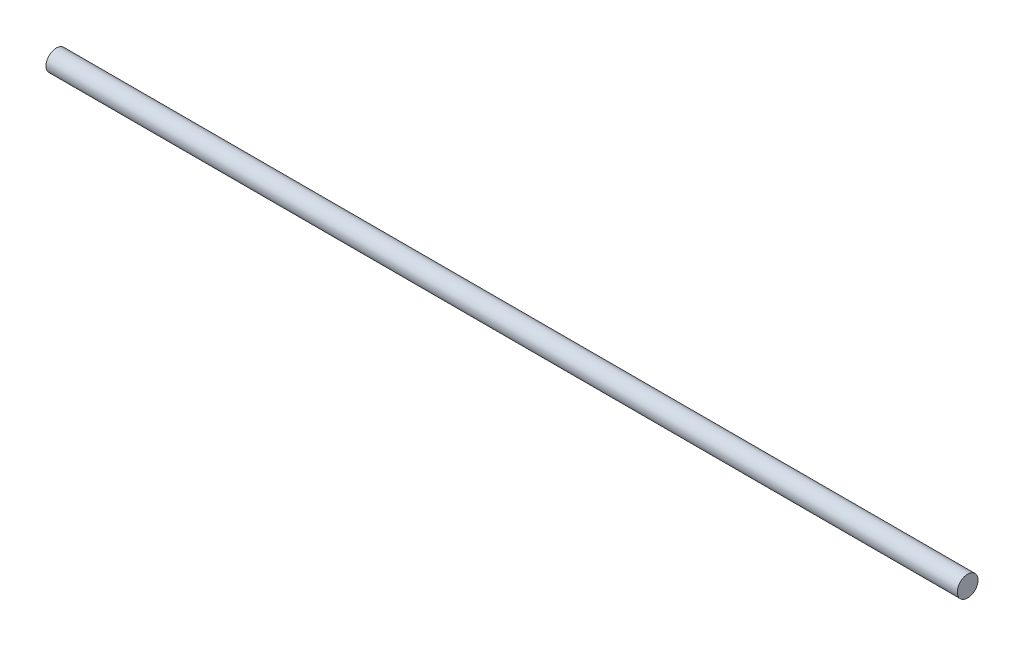
ISO-10303-21;
HEADER;
FILE_DESCRIPTION(('STEP AP214'),'2;1');
FILE_NAME('part.step','',(''),(''),'','','');
FILE_SCHEMA(('AUTOMOTIVE_DESIGN { 1 0 10303 214 1 1 1 1 }'));
ENDSEC;
DATA;
#1=APPLICATION_CONTEXT('core data for automotive mechanical design processes');
#2=APPLICATION_PROTOCOL_DEFINITION('international standard','automotive_design',2000,#1);
#3=PRODUCT_CONTEXT('',#1,'mechanical');
#4=PRODUCT('Part','Part','',(#3));
#5=PRODUCT_RELATED_PRODUCT_CATEGORY('part','',(#4));
#6=PRODUCT_DEFINITION_FORMATION('','',#4);
#7=PRODUCT_DEFINITION_CONTEXT('part definition',#1,'design');
#8=PRODUCT_DEFINITION('design','',#6,#7);
#9=PRODUCT_DEFINITION_SHAPE('','',#8);
#10=(LENGTH_UNIT() NAMED_UNIT(*) SI_UNIT(.MILLI.,.METRE.));
#11=(NAMED_UNIT(*) PLANE_ANGLE_UNIT() SI_UNIT($,.RADIAN.));
#12=(NAMED_UNIT(*) SI_UNIT($,.STERADIAN.) SOLID_ANGLE_UNIT());
#13=UNCERTAINTY_MEASURE_WITH_UNIT(LENGTH_MEASURE(1.E-05),#10,'distance_accuracy_value','');
#14=(GEOMETRIC_REPRESENTATION_CONTEXT(3) GLOBAL_UNCERTAINTY_ASSIGNED_CONTEXT((#13)) GLOBAL_UNIT_ASSIGNED_CONTEXT((#10,
#11,#12)) REPRESENTATION_CONTEXT('',''));
#15=CARTESIAN_POINT('',(0.,0.,0.));
#16=DIRECTION('',(0.,0.,1.));
#17=DIRECTION('',(1.,0.,0.));
#18=AXIS2_PLACEMENT_3D('',#15,#16,#17);
#19=CARTESIAN_POINT('',(0.,0.,0.));
#20=DIRECTION('',(1.,0.,0.));
#21=DIRECTION('',(0.,0.,-1.));
#22=AXIS2_PLACEMENT_3D('',#19,#20,#21);
#23=PLANE('',#22);
#24=CARTESIAN_POINT('',(0.,0.,0.));
#25=DIRECTION('',(-1.,0.,0.));
#26=DIRECTION('',(0.,0.,1.));
#27=AXIS2_PLACEMENT_3D('',#24,#25,#26);
#28=CIRCLE('',#27,12.7);
#29=CARTESIAN_POINT('',(0.,0.,12.7));
#30=VERTEX_POINT('',#29);
#31=EDGE_CURVE('E10',#30,#30,#28,.T.);
#32=ORIENTED_EDGE('',*,*,#31,.T.);
#33=EDGE_LOOP('',(#32));
#34=FACE_BOUND('',#33,.T.);
#35=ADVANCED_FACE('F37',(#34),#23,.F.);
#36=CARTESIAN_POINT('',(0.,0.,0.));
#37=DIRECTION('',(-1.,0.,0.));
#38=DIRECTION('',(0.,0.,1.));
#39=AXIS2_PLACEMENT_3D('',#36,#37,#38);
#40=CYLINDRICAL_SURFACE('',#39,12.7);
#41=ORIENTED_EDGE('',*,*,#31,.F.);
#42=EDGE_LOOP('',(#41));
#43=FACE_BOUND('',#42,.T.);
#44=CARTESIAN_POINT('',(1117.6,0.,0.));
#45=DIRECTION('',(-1.,0.,0.));
#46=DIRECTION('',(0.,0.,1.));
#47=AXIS2_PLACEMENT_3D('',#44,#45,#46);
#48=CIRCLE('',#47,12.7);
#49=CARTESIAN_POINT('',(1117.6,0.,12.7));
#50=VERTEX_POINT('',#49);
#51=EDGE_CURVE('E44',#50,#50,#48,.T.);
#52=ORIENTED_EDGE('',*,*,#51,.T.);
#53=EDGE_LOOP('',(#52));
#54=FACE_BOUND('',#53,.T.);
#55=ADVANCED_FACE('F51',(#43,#54),#40,.T.);
#56=CARTESIAN_POINT('',(1117.6,0.,0.));
#57=DIRECTION('',(-1.,0.,0.));
#58=DIRECTION('',(0.,0.,1.));
#59=AXIS2_PLACEMENT_3D('',#56,#57,#58);
#60=PLANE('',#59);
#61=ORIENTED_EDGE('',*,*,#51,.F.);
#62=EDGE_LOOP('',(#61));
#63=FACE_BOUND('',#62,.T.);
#64=ADVANCED_FACE('F53',(#63),#60,.F.);
#65=CLOSED_SHELL('',(#35,#55,#64));
#66=MANIFOLD_SOLID_BREP('B2',#65);
#67=ADVANCED_BREP_SHAPE_REPRESENTATION('',(#18,#66),#14);
#68=SHAPE_DEFINITION_REPRESENTATION(#9,#67);
ENDSEC;
END-ISO-10303-21;
